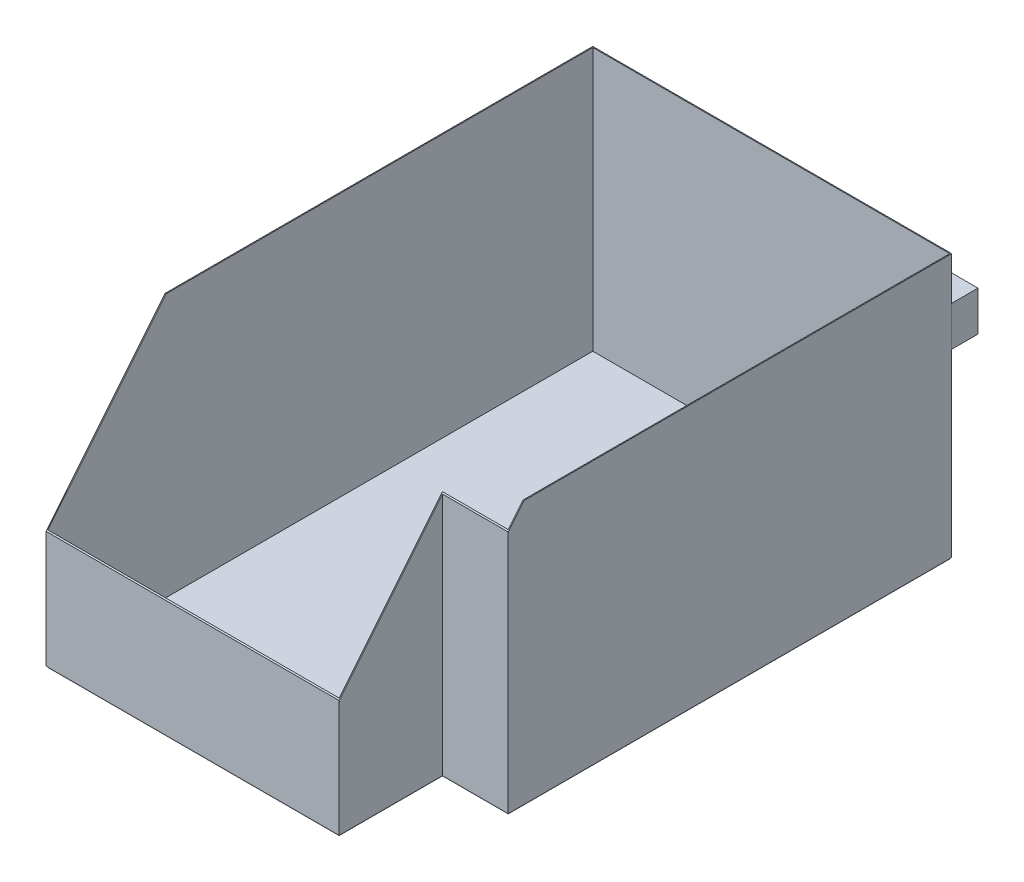
ISO-10303-21;
HEADER;
FILE_DESCRIPTION(('STEP AP214'),'2;1');
FILE_NAME('part.step','',(''),(''),'','','');
FILE_SCHEMA(('AUTOMOTIVE_DESIGN { 1 0 10303 214 1 1 1 1 }'));
ENDSEC;
DATA;
#1=APPLICATION_CONTEXT('core data for automotive mechanical design processes');
#2=APPLICATION_PROTOCOL_DEFINITION('international standard','automotive_design',2000,#1);
#3=PRODUCT_CONTEXT('',#1,'mechanical');
#4=PRODUCT('Part','Part','',(#3));
#5=PRODUCT_RELATED_PRODUCT_CATEGORY('part','',(#4));
#6=PRODUCT_DEFINITION_FORMATION('','',#4);
#7=PRODUCT_DEFINITION_CONTEXT('part definition',#1,'design');
#8=PRODUCT_DEFINITION('design','',#6,#7);
#9=PRODUCT_DEFINITION_SHAPE('','',#8);
#10=(LENGTH_UNIT() NAMED_UNIT(*) SI_UNIT(.MILLI.,.METRE.));
#11=(NAMED_UNIT(*) PLANE_ANGLE_UNIT() SI_UNIT($,.RADIAN.));
#12=(NAMED_UNIT(*) SI_UNIT($,.STERADIAN.) SOLID_ANGLE_UNIT());
#13=UNCERTAINTY_MEASURE_WITH_UNIT(LENGTH_MEASURE(1.E-05),#10,'distance_accuracy_value','');
#14=(GEOMETRIC_REPRESENTATION_CONTEXT(3) GLOBAL_UNCERTAINTY_ASSIGNED_CONTEXT((#13)) GLOBAL_UNIT_ASSIGNED_CONTEXT((#10,
#11,#12)) REPRESENTATION_CONTEXT('',''));
#15=CARTESIAN_POINT('',(0.,0.,0.));
#16=DIRECTION('',(0.,0.,1.));
#17=DIRECTION('',(1.,0.,0.));
#18=AXIS2_PLACEMENT_3D('',#15,#16,#17);
#19=CARTESIAN_POINT('',(232.848616765358,234.676087490139,-197.826300095906));
#20=DIRECTION('',(-1.,0.,0.));
#21=DIRECTION('',(0.,-1.,0.));
#22=AXIS2_PLACEMENT_3D('',#19,#20,#21);
#23=PLANE('',#22);
#24=DIRECTION('',(0.,-1.,0.));
#25=VECTOR('',#24,1.);
#26=CARTESIAN_POINT('',(232.848616765358,234.676087490139,-167.826300095906));
#27=LINE('',#26,#25);
#28=CARTESIAN_POINT('',(232.848616765358,234.676087490139,-167.826300095906));
#29=VERTEX_POINT('',#28);
#30=CARTESIAN_POINT('',(232.848616765358,192.290545925534,-167.826300095906));
#31=VERTEX_POINT('',#30);
#32=EDGE_CURVE('E111',#29,#31,#27,.T.);
#33=ORIENTED_EDGE('',*,*,#32,.T.);
#34=DIRECTION('',(0.,0.,1.));
#35=VECTOR('',#34,1.);
#36=CARTESIAN_POINT('',(232.848616765358,192.290545925534,-197.826300095906));
#37=LINE('',#36,#35);
#38=CARTESIAN_POINT('',(232.848616765358,192.290545925534,-197.826300095906));
#39=VERTEX_POINT('',#38);
#40=EDGE_CURVE('E12',#39,#31,#37,.T.);
#41=ORIENTED_EDGE('',*,*,#40,.F.);
#42=DIRECTION('',(0.,-1.,0.));
#43=VECTOR('',#42,1.);
#44=CARTESIAN_POINT('',(232.848616765358,234.676087490139,-197.826300095906));
#45=LINE('',#44,#43);
#46=CARTESIAN_POINT('',(232.848616765358,234.676087490139,-197.826300095906));
#47=VERTEX_POINT('',#46);
#48=EDGE_CURVE('E99',#47,#39,#45,.T.);
#49=ORIENTED_EDGE('',*,*,#48,.F.);
#50=DIRECTION('',(0.,0.,1.));
#51=VECTOR('',#50,1.);
#52=CARTESIAN_POINT('',(232.848616765358,234.676087490139,-197.826300095906));
#53=LINE('',#52,#51);
#54=EDGE_CURVE('E107',#47,#29,#53,.T.);
#55=ORIENTED_EDGE('',*,*,#54,.T.);
#56=EDGE_LOOP('',(#33,#41,#49,#55));
#57=FACE_BOUND('',#56,.T.);
#58=ADVANCED_FACE('F48',(#57),#23,.F.);
#59=CARTESIAN_POINT('',(232.848616765358,192.290545925534,-197.826300095906));
#60=DIRECTION('',(0.,1.,0.));
#61=DIRECTION('',(0.,0.,1.));
#62=AXIS2_PLACEMENT_3D('',#59,#60,#61);
#63=PLANE('',#62);
#64=DIRECTION('',(-1.,0.,0.));
#65=VECTOR('',#64,1.);
#66=CARTESIAN_POINT('',(232.848616765358,192.290545925534,-167.826300095906));
#67=LINE('',#66,#65);
#68=CARTESIAN_POINT('',(-147.151383234642,192.290545925534,-167.826300095906));
#69=VERTEX_POINT('',#68);
#70=EDGE_CURVE('E103',#31,#69,#67,.T.);
#71=ORIENTED_EDGE('',*,*,#70,.T.);
#72=DIRECTION('',(0.,0.,1.));
#73=VECTOR('',#72,1.);
#74=CARTESIAN_POINT('',(-147.151383234642,192.290545925534,-197.826300095906));
#75=LINE('',#74,#73);
#76=CARTESIAN_POINT('',(-147.151383234642,192.290545925534,-197.826300095906));
#77=VERTEX_POINT('',#76);
#78=EDGE_CURVE('E56',#77,#69,#75,.T.);
#79=ORIENTED_EDGE('',*,*,#78,.F.);
#80=DIRECTION('',(-1.,0.,0.));
#81=VECTOR('',#80,1.);
#82=CARTESIAN_POINT('',(232.848616765358,192.290545925534,-197.826300095906));
#83=LINE('',#82,#81);
#84=EDGE_CURVE('E94',#39,#77,#83,.T.);
#85=ORIENTED_EDGE('',*,*,#84,.F.);
#86=ORIENTED_EDGE('',*,*,#40,.T.);
#87=EDGE_LOOP('',(#71,#79,#85,#86));
#88=FACE_BOUND('',#87,.T.);
#89=ADVANCED_FACE('F102',(#88),#63,.F.);
#90=CARTESIAN_POINT('',(-147.151383234642,234.676087490139,-197.826300095906));
#91=DIRECTION('',(1.,0.,0.));
#92=DIRECTION('',(0.,0.,-1.));
#93=AXIS2_PLACEMENT_3D('',#90,#91,#92);
#94=PLANE('',#93);
#95=DIRECTION('',(0.,1.,0.));
#96=VECTOR('',#95,1.);
#97=CARTESIAN_POINT('',(-147.151383234642,234.676087490139,-167.826300095906));
#98=LINE('',#97,#96);
#99=CARTESIAN_POINT('',(-147.151383234642,234.676087490139,-167.826300095906));
#100=VERTEX_POINT('',#99);
#101=EDGE_CURVE('E81',#69,#100,#98,.T.);
#102=ORIENTED_EDGE('',*,*,#101,.T.);
#103=DIRECTION('',(0.,0.,1.));
#104=VECTOR('',#103,1.);
#105=CARTESIAN_POINT('',(-147.151383234642,234.676087490139,-197.826300095906));
#106=LINE('',#105,#104);
#107=CARTESIAN_POINT('',(-147.151383234642,234.676087490139,-197.826300095906));
#108=VERTEX_POINT('',#107);
#109=EDGE_CURVE('E104',#108,#100,#106,.T.);
#110=ORIENTED_EDGE('',*,*,#109,.F.);
#111=DIRECTION('',(0.,1.,0.));
#112=VECTOR('',#111,1.);
#113=CARTESIAN_POINT('',(-147.151383234642,234.676087490139,-197.826300095906));
#114=LINE('',#113,#112);
#115=EDGE_CURVE('E97',#77,#108,#114,.T.);
#116=ORIENTED_EDGE('',*,*,#115,.F.);
#117=ORIENTED_EDGE('',*,*,#78,.T.);
#118=EDGE_LOOP('',(#102,#110,#116,#117));
#119=FACE_BOUND('',#118,.T.);
#120=ADVANCED_FACE('F105',(#119),#94,.F.);
#121=CARTESIAN_POINT('',(232.848616765358,234.676087490139,-197.826300095906));
#122=DIRECTION('',(0.,-1.,0.));
#123=DIRECTION('',(0.,0.,-1.));
#124=AXIS2_PLACEMENT_3D('',#121,#122,#123);
#125=PLANE('',#124);
#126=DIRECTION('',(1.,0.,0.));
#127=VECTOR('',#126,1.);
#128=CARTESIAN_POINT('',(232.848616765358,234.676087490139,-167.826300095906));
#129=LINE('',#128,#127);
#130=EDGE_CURVE('E87',#100,#29,#129,.T.);
#131=ORIENTED_EDGE('',*,*,#130,.T.);
#132=ORIENTED_EDGE('',*,*,#54,.F.);
#133=DIRECTION('',(1.,0.,0.));
#134=VECTOR('',#133,1.);
#135=CARTESIAN_POINT('',(232.848616765358,234.676087490139,-197.826300095906));
#136=LINE('',#135,#134);
#137=EDGE_CURVE('E64',#108,#47,#136,.T.);
#138=ORIENTED_EDGE('',*,*,#137,.F.);
#139=ORIENTED_EDGE('',*,*,#109,.T.);
#140=EDGE_LOOP('',(#131,#132,#138,#139));
#141=FACE_BOUND('',#140,.T.);
#142=ADVANCED_FACE('F118',(#141),#125,.F.);
#143=CARTESIAN_POINT('',(0.,0.,-197.826300095906));
#144=DIRECTION('',(0.,0.,-1.));
#145=DIRECTION('',(-1.,0.,0.));
#146=AXIS2_PLACEMENT_3D('',#143,#144,#145);
#147=PLANE('',#146);
#148=ORIENTED_EDGE('',*,*,#48,.T.);
#149=ORIENTED_EDGE('',*,*,#84,.T.);
#150=ORIENTED_EDGE('',*,*,#115,.T.);
#151=ORIENTED_EDGE('',*,*,#137,.T.);
#152=EDGE_LOOP('',(#148,#149,#150,#151));
#153=FACE_BOUND('',#152,.T.);
#154=ADVANCED_FACE('F95',(#153),#147,.T.);
#155=CARTESIAN_POINT('',(0.,0.,-167.826300095906));
#156=DIRECTION('',(0.,0.,-1.));
#157=DIRECTION('',(-1.,0.,0.));
#158=AXIS2_PLACEMENT_3D('',#155,#156,#157);
#159=PLANE('',#158);
#160=ORIENTED_EDGE('',*,*,#32,.F.);
#161=ORIENTED_EDGE('',*,*,#130,.F.);
#162=ORIENTED_EDGE('',*,*,#101,.F.);
#163=ORIENTED_EDGE('',*,*,#70,.F.);
#164=EDGE_LOOP('',(#160,#161,#162,#163));
#165=FACE_BOUND('',#164,.T.);
#166=ADVANCED_FACE('F121',(#165),#159,.F.);
#167=CLOSED_SHELL('',(#58,#89,#120,#142,#154,#166));
#168=MANIFOLD_SOLID_BREP('B2',#167);
#169=CARTESIAN_POINT('',(0.,281.5,0.));
#170=DIRECTION('',(0.,1.,0.));
#171=DIRECTION('',(0.,0.,1.));
#172=AXIS2_PLACEMENT_3D('',#169,#170,#171);
#173=PLANE('',#172);
#174=DIRECTION('',(-1.,0.,0.));
#175=VECTOR('',#174,1.);
#176=CARTESIAN_POINT('',(233.848616765358,281.5,286.395099081049));
#177=LINE('',#176,#175);
#178=CARTESIAN_POINT('',(233.848616765358,281.5,286.395099081049));
#179=VERTEX_POINT('',#178);
#180=CARTESIAN_POINT('',(232.848616765358,281.5,286.395099081049));
#181=VERTEX_POINT('',#180);
#182=EDGE_CURVE('E195',#179,#181,#177,.T.);
#183=ORIENTED_EDGE('',*,*,#182,.F.);
#184=DIRECTION('',(0.,0.,-1.));
#185=VECTOR('',#184,1.);
#186=CARTESIAN_POINT('',(233.848616765358,281.5,303.173699904094));
#187=LINE('',#186,#185);
#188=CARTESIAN_POINT('',(233.848616765358,281.5,-168.826300095906));
#189=VERTEX_POINT('',#188);
#190=EDGE_CURVE('E304',#179,#189,#187,.T.);
#191=ORIENTED_EDGE('',*,*,#190,.T.);
#192=DIRECTION('',(-1.,0.,0.));
#193=VECTOR('',#192,1.);
#194=CARTESIAN_POINT('',(233.848616765358,281.5,-168.826300095906));
#195=LINE('',#194,#193);
#196=CARTESIAN_POINT('',(-148.151383234642,281.5,-168.826300095906));
#197=VERTEX_POINT('',#196);
#198=EDGE_CURVE('E302',#189,#197,#195,.T.);
#199=ORIENTED_EDGE('',*,*,#198,.T.);
#200=DIRECTION('',(0.,0.,1.));
#201=VECTOR('',#200,1.);
#202=CARTESIAN_POINT('',(-148.151383234642,281.5,-168.826300095906));
#203=LINE('',#202,#201);
#204=CARTESIAN_POINT('',(-148.151383234642,281.5,286.395099081049));
#205=VERTEX_POINT('',#204);
#206=EDGE_CURVE('E298',#197,#205,#203,.T.);
#207=ORIENTED_EDGE('',*,*,#206,.T.);
#208=CARTESIAN_POINT('',(-147.151383234642,281.5,286.395099081049));
#209=VERTEX_POINT('',#208);
#210=EDGE_CURVE('E281',#209,#205,#177,.T.);
#211=ORIENTED_EDGE('',*,*,#210,.F.);
#212=DIRECTION('',(0.,0.,1.));
#213=VECTOR('',#212,1.);
#214=CARTESIAN_POINT('',(-147.151383234642,281.5,-167.826300095906));
#215=LINE('',#214,#213);
#216=CARTESIAN_POINT('',(-147.151383234642,281.5,-167.826300095906));
#217=VERTEX_POINT('',#216);
#218=EDGE_CURVE('E375',#217,#209,#215,.T.);
#219=ORIENTED_EDGE('',*,*,#218,.F.);
#220=DIRECTION('',(-1.,0.,0.));
#221=VECTOR('',#220,1.);
#222=CARTESIAN_POINT('',(232.848616765358,281.5,-167.826300095906));
#223=LINE('',#222,#221);
#224=CARTESIAN_POINT('',(232.848616765358,281.5,-167.826300095906));
#225=VERTEX_POINT('',#224);
#226=EDGE_CURVE('E373',#225,#217,#223,.T.);
#227=ORIENTED_EDGE('',*,*,#226,.F.);
#228=DIRECTION('',(0.,0.,-1.));
#229=VECTOR('',#228,1.);
#230=CARTESIAN_POINT('',(232.848616765358,281.5,302.173699904094));
#231=LINE('',#230,#229);
#232=EDGE_CURVE('E378',#181,#225,#231,.T.);
#233=ORIENTED_EDGE('',*,*,#232,.F.);
#234=EDGE_LOOP('',(#183,#191,#199,#207,#211,#219,#227,#233));
#235=FACE_BOUND('',#234,.T.);
#236=ADVANCED_FACE('F181',(#235),#173,.T.);
#237=CARTESIAN_POINT('',(0.,1.5,0.));
#238=DIRECTION('',(0.,1.,0.));
#239=DIRECTION('',(0.,0.,1.));
#240=AXIS2_PLACEMENT_3D('',#237,#238,#239);
#241=PLANE('',#240);
#242=DIRECTION('',(0.,0.,1.));
#243=VECTOR('',#242,1.);
#244=CARTESIAN_POINT('',(-148.151383234642,1.5,-168.826300095906));
#245=LINE('',#244,#243);
#246=CARTESIAN_POINT('',(-148.151383234642,1.5,-168.826300095906));
#247=VERTEX_POINT('',#246);
#248=CARTESIAN_POINT('',(-148.151383234642,1.5,413.173699904094));
#249=VERTEX_POINT('',#248);
#250=EDGE_CURVE('E316',#247,#249,#245,.T.);
#251=ORIENTED_EDGE('',*,*,#250,.F.);
#252=DIRECTION('',(-1.,0.,0.));
#253=VECTOR('',#252,1.);
#254=CARTESIAN_POINT('',(233.848616765358,1.5,-168.826300095906));
#255=LINE('',#254,#253);
#256=CARTESIAN_POINT('',(233.848616765358,1.5,-168.826300095906));
#257=VERTEX_POINT('',#256);
#258=EDGE_CURVE('E305',#257,#247,#255,.T.);
#259=ORIENTED_EDGE('',*,*,#258,.F.);
#260=DIRECTION('',(0.,0.,-1.));
#261=VECTOR('',#260,1.);
#262=CARTESIAN_POINT('',(233.848616765358,1.5,303.173699904094));
#263=LINE('',#262,#261);
#264=CARTESIAN_POINT('',(233.848616765358,1.5,303.173699904094));
#265=VERTEX_POINT('',#264);
#266=EDGE_CURVE('E308',#265,#257,#263,.T.);
#267=ORIENTED_EDGE('',*,*,#266,.F.);
#268=DIRECTION('',(1.,0.,0.));
#269=VECTOR('',#268,1.);
#270=CARTESIAN_POINT('',(163.848616765358,1.5,303.173699904094));
#271=LINE('',#270,#269);
#272=CARTESIAN_POINT('',(163.848616765358,1.5,303.173699904094));
#273=VERTEX_POINT('',#272);
#274=EDGE_CURVE('E324',#273,#265,#271,.T.);
#275=ORIENTED_EDGE('',*,*,#274,.F.);
#276=DIRECTION('',(0.,0.,-1.));
#277=VECTOR('',#276,1.);
#278=CARTESIAN_POINT('',(163.848616765358,1.5,413.173699904094));
#279=LINE('',#278,#277);
#280=CARTESIAN_POINT('',(163.848616765358,1.5,413.173699904094));
#281=VERTEX_POINT('',#280);
#282=EDGE_CURVE('E321',#281,#273,#279,.T.);
#283=ORIENTED_EDGE('',*,*,#282,.F.);
#284=DIRECTION('',(1.,0.,0.));
#285=VECTOR('',#284,1.);
#286=CARTESIAN_POINT('',(-148.151383234642,1.5,413.173699904094));
#287=LINE('',#286,#285);
#288=EDGE_CURVE('E318',#249,#281,#287,.T.);
#289=ORIENTED_EDGE('',*,*,#288,.F.);
#290=EDGE_LOOP('',(#251,#259,#267,#275,#283,#289));
#291=FACE_BOUND('',#290,.T.);
#292=DIRECTION('',(-1.,0.,0.));
#293=VECTOR('',#292,1.);
#294=CARTESIAN_POINT('',(232.848616765358,1.5,-167.826300095906));
#295=LINE('',#294,#293);
#296=CARTESIAN_POINT('',(232.848616765358,1.5,-167.826300095906));
#297=VERTEX_POINT('',#296);
#298=CARTESIAN_POINT('',(-147.151383234642,1.5,-167.826300095906));
#299=VERTEX_POINT('',#298);
#300=EDGE_CURVE('E203',#297,#299,#295,.T.);
#301=ORIENTED_EDGE('',*,*,#300,.T.);
#302=DIRECTION('',(0.,0.,1.));
#303=VECTOR('',#302,1.);
#304=CARTESIAN_POINT('',(-147.151383234642,1.5,-167.826300095906));
#305=LINE('',#304,#303);
#306=CARTESIAN_POINT('',(-147.151383234642,1.5,412.173699904094));
#307=VERTEX_POINT('',#306);
#308=EDGE_CURVE('E368',#299,#307,#305,.T.);
#309=ORIENTED_EDGE('',*,*,#308,.T.);
#310=DIRECTION('',(1.,0.,0.));
#311=VECTOR('',#310,1.);
#312=CARTESIAN_POINT('',(-147.151383234642,1.5,412.173699904094));
#313=LINE('',#312,#311);
#314=CARTESIAN_POINT('',(162.848616765358,1.5,412.173699904094));
#315=VERTEX_POINT('',#314);
#316=EDGE_CURVE('E383',#307,#315,#313,.T.);
#317=ORIENTED_EDGE('',*,*,#316,.T.);
#318=DIRECTION('',(0.,0.,-1.));
#319=VECTOR('',#318,1.);
#320=CARTESIAN_POINT('',(162.848616765358,1.5,412.173699904094));
#321=LINE('',#320,#319);
#322=CARTESIAN_POINT('',(162.848616765358,1.5,302.173699904094));
#323=VERTEX_POINT('',#322);
#324=EDGE_CURVE('E386',#315,#323,#321,.T.);
#325=ORIENTED_EDGE('',*,*,#324,.T.);
#326=DIRECTION('',(1.,0.,0.));
#327=VECTOR('',#326,1.);
#328=CARTESIAN_POINT('',(162.848616765358,1.5,302.173699904094));
#329=LINE('',#328,#327);
#330=CARTESIAN_POINT('',(232.848616765358,1.5,302.173699904094));
#331=VERTEX_POINT('',#330);
#332=EDGE_CURVE('E389',#323,#331,#329,.T.);
#333=ORIENTED_EDGE('',*,*,#332,.T.);
#334=DIRECTION('',(0.,0.,-1.));
#335=VECTOR('',#334,1.);
#336=CARTESIAN_POINT('',(232.848616765358,1.5,302.173699904094));
#337=LINE('',#336,#335);
#338=EDGE_CURVE('E376',#331,#297,#337,.T.);
#339=ORIENTED_EDGE('',*,*,#338,.T.);
#340=EDGE_LOOP('',(#301,#309,#317,#325,#333,#339));
#341=FACE_BOUND('',#340,.T.);
#342=ADVANCED_FACE('F345',(#291,#341),#241,.F.);
#343=CARTESIAN_POINT('',(-148.151383234642,281.5,-168.826300095906));
#344=DIRECTION('',(1.,0.,0.));
#345=DIRECTION('',(0.,0.,-1.));
#346=AXIS2_PLACEMENT_3D('',#343,#344,#345);
#347=PLANE('',#346);
#348=DIRECTION('',(0.,-1.,0.));
#349=VECTOR('',#348,1.);
#350=CARTESIAN_POINT('',(-148.151383234642,281.5,413.173699904094));
#351=LINE('',#350,#349);
#352=CARTESIAN_POINT('',(-148.151383234642,125.528052126202,413.173699904094));
#353=VERTEX_POINT('',#352);
#354=EDGE_CURVE('E189',#353,#249,#351,.T.);
#355=ORIENTED_EDGE('',*,*,#354,.F.);
#356=DIRECTION('',(0.,-0.775988846940404,0.630746628547551));
#357=VECTOR('',#356,1.);
#358=CARTESIAN_POINT('',(-148.151383234642,125.528052126202,413.173699904094));
#359=LINE('',#358,#357);
#360=EDGE_CURVE('E284',#205,#353,#359,.T.);
#361=ORIENTED_EDGE('',*,*,#360,.F.);
#362=ORIENTED_EDGE('',*,*,#206,.F.);
#363=DIRECTION('',(0.,-1.,0.));
#364=VECTOR('',#363,1.);
#365=CARTESIAN_POINT('',(-148.151383234642,281.5,-168.826300095906));
#366=LINE('',#365,#364);
#367=EDGE_CURVE('E315',#197,#247,#366,.T.);
#368=ORIENTED_EDGE('',*,*,#367,.T.);
#369=ORIENTED_EDGE('',*,*,#250,.T.);
#370=EDGE_LOOP('',(#355,#361,#362,#368,#369));
#371=FACE_BOUND('',#370,.T.);
#372=ADVANCED_FACE('F183',(#371),#347,.F.);
#373=CARTESIAN_POINT('',(-148.151383234642,281.5,413.173699904094));
#374=DIRECTION('',(0.,0.,-1.));
#375=DIRECTION('',(-1.,0.,0.));
#376=AXIS2_PLACEMENT_3D('',#373,#374,#375);
#377=PLANE('',#376);
#378=DIRECTION('',(0.,-1.,0.));
#379=VECTOR('',#378,1.);
#380=CARTESIAN_POINT('',(163.848616765358,281.5,413.173699904094));
#381=LINE('',#380,#379);
#382=CARTESIAN_POINT('',(163.848616765358,125.528052126202,413.173699904094));
#383=VERTEX_POINT('',#382);
#384=EDGE_CURVE('E336',#383,#281,#381,.T.);
#385=ORIENTED_EDGE('',*,*,#384,.F.);
#386=DIRECTION('',(-1.,0.,0.));
#387=VECTOR('',#386,1.);
#388=CARTESIAN_POINT('',(233.848616765358,125.528052126202,413.173699904094));
#389=LINE('',#388,#387);
#390=EDGE_CURVE('E342',#383,#353,#389,.T.);
#391=ORIENTED_EDGE('',*,*,#390,.T.);
#392=ORIENTED_EDGE('',*,*,#354,.T.);
#393=ORIENTED_EDGE('',*,*,#288,.T.);
#394=EDGE_LOOP('',(#385,#391,#392,#393));
#395=FACE_BOUND('',#394,.T.);
#396=ADVANCED_FACE('F340',(#395),#377,.F.);
#397=CARTESIAN_POINT('',(163.848616765358,281.5,413.173699904094));
#398=DIRECTION('',(-1.,0.,0.));
#399=DIRECTION('',(0.,0.,1.));
#400=AXIS2_PLACEMENT_3D('',#397,#398,#399);
#401=PLANE('',#400);
#402=DIRECTION('',(0.,-1.,0.));
#403=VECTOR('',#402,1.);
#404=CARTESIAN_POINT('',(163.848616765358,281.5,303.173699904094));
#405=LINE('',#404,#403);
#406=CARTESIAN_POINT('',(163.848616765358,260.857785651697,303.173699904094));
#407=VERTEX_POINT('',#406);
#408=EDGE_CURVE('E334',#407,#273,#405,.T.);
#409=ORIENTED_EDGE('',*,*,#408,.F.);
#410=DIRECTION('',(0.,-0.775988846940404,0.630746628547551));
#411=VECTOR('',#410,1.);
#412=CARTESIAN_POINT('',(163.848616765358,219.44791602446,336.832863639444));
#413=LINE('',#412,#411);
#414=EDGE_CURVE('E366',#407,#383,#413,.T.);
#415=ORIENTED_EDGE('',*,*,#414,.T.);
#416=ORIENTED_EDGE('',*,*,#384,.T.);
#417=ORIENTED_EDGE('',*,*,#282,.T.);
#418=EDGE_LOOP('',(#409,#415,#416,#417));
#419=FACE_BOUND('',#418,.T.);
#420=ADVANCED_FACE('F365',(#419),#401,.F.);
#421=CARTESIAN_POINT('',(163.848616765358,281.5,303.173699904094));
#422=DIRECTION('',(0.,0.,-1.));
#423=DIRECTION('',(-1.,0.,0.));
#424=AXIS2_PLACEMENT_3D('',#421,#422,#423);
#425=PLANE('',#424);
#426=DIRECTION('',(0.,-1.,0.));
#427=VECTOR('',#426,1.);
#428=CARTESIAN_POINT('',(233.848616765358,281.5,303.173699904094));
#429=LINE('',#428,#427);
#430=CARTESIAN_POINT('',(233.848616765358,260.857785651697,303.173699904094));
#431=VERTEX_POINT('',#430);
#432=EDGE_CURVE('E332',#431,#265,#429,.T.);
#433=ORIENTED_EDGE('',*,*,#432,.F.);
#434=DIRECTION('',(-1.,0.,0.));
#435=VECTOR('',#434,1.);
#436=CARTESIAN_POINT('',(163.848616765358,260.857785651697,303.173699904094));
#437=LINE('',#436,#435);
#438=EDGE_CURVE('E362',#431,#407,#437,.T.);
#439=ORIENTED_EDGE('',*,*,#438,.T.);
#440=ORIENTED_EDGE('',*,*,#408,.T.);
#441=ORIENTED_EDGE('',*,*,#274,.T.);
#442=EDGE_LOOP('',(#433,#439,#440,#441));
#443=FACE_BOUND('',#442,.T.);
#444=ADVANCED_FACE('F360',(#443),#425,.F.);
#445=CARTESIAN_POINT('',(233.848616765358,281.5,303.173699904094));
#446=DIRECTION('',(-1.,0.,0.));
#447=DIRECTION('',(0.,0.,1.));
#448=AXIS2_PLACEMENT_3D('',#445,#446,#447);
#449=PLANE('',#448);
#450=ORIENTED_EDGE('',*,*,#190,.F.);
#451=DIRECTION('',(0.,-0.775988846940404,0.630746628547551));
#452=VECTOR('',#451,1.);
#453=CARTESIAN_POINT('',(233.848616765358,125.528052126202,413.173699904094));
#454=LINE('',#453,#452);
#455=EDGE_CURVE('E292',#179,#431,#454,.T.);
#456=ORIENTED_EDGE('',*,*,#455,.T.);
#457=ORIENTED_EDGE('',*,*,#432,.T.);
#458=ORIENTED_EDGE('',*,*,#266,.T.);
#459=DIRECTION('',(0.,-1.,0.));
#460=VECTOR('',#459,1.);
#461=CARTESIAN_POINT('',(233.848616765358,281.5,-168.826300095906));
#462=LINE('',#461,#460);
#463=EDGE_CURVE('E329',#189,#257,#462,.T.);
#464=ORIENTED_EDGE('',*,*,#463,.F.);
#465=EDGE_LOOP('',(#450,#456,#457,#458,#464));
#466=FACE_BOUND('',#465,.T.);
#467=ADVANCED_FACE('F355',(#466),#449,.F.);
#468=CARTESIAN_POINT('',(233.848616765358,281.5,-168.826300095906));
#469=DIRECTION('',(0.,0.,1.));
#470=DIRECTION('',(1.,0.,0.));
#471=AXIS2_PLACEMENT_3D('',#468,#469,#470);
#472=PLANE('',#471);
#473=ORIENTED_EDGE('',*,*,#258,.T.);
#474=ORIENTED_EDGE('',*,*,#367,.F.);
#475=ORIENTED_EDGE('',*,*,#198,.F.);
#476=ORIENTED_EDGE('',*,*,#463,.T.);
#477=EDGE_LOOP('',(#473,#474,#475,#476));
#478=FACE_BOUND('',#477,.T.);
#479=ADVANCED_FACE('F350',(#478),#472,.F.);
#480=CARTESIAN_POINT('',(232.848616765358,281.5,-167.826300095906));
#481=DIRECTION('',(0.,0.,1.));
#482=DIRECTION('',(1.,0.,0.));
#483=AXIS2_PLACEMENT_3D('',#480,#481,#482);
#484=PLANE('',#483);
#485=ORIENTED_EDGE('',*,*,#300,.F.);
#486=DIRECTION('',(0.,-1.,0.));
#487=VECTOR('',#486,1.);
#488=CARTESIAN_POINT('',(232.848616765358,281.5,-167.826300095906));
#489=LINE('',#488,#487);
#490=EDGE_CURVE('E379',#225,#297,#489,.T.);
#491=ORIENTED_EDGE('',*,*,#490,.F.);
#492=ORIENTED_EDGE('',*,*,#226,.T.);
#493=DIRECTION('',(0.,-1.,0.));
#494=VECTOR('',#493,1.);
#495=CARTESIAN_POINT('',(-147.151383234642,281.5,-167.826300095906));
#496=LINE('',#495,#494);
#497=EDGE_CURVE('E311',#217,#299,#496,.T.);
#498=ORIENTED_EDGE('',*,*,#497,.T.);
#499=EDGE_LOOP('',(#485,#491,#492,#498));
#500=FACE_BOUND('',#499,.T.);
#501=ADVANCED_FACE('F405',(#500),#484,.T.);
#502=CARTESIAN_POINT('',(-147.151383234642,281.5,-167.826300095906));
#503=DIRECTION('',(1.,0.,0.));
#504=DIRECTION('',(0.,0.,-1.));
#505=AXIS2_PLACEMENT_3D('',#502,#503,#504);
#506=PLANE('',#505);
#507=DIRECTION('',(0.,0.775988846940404,-0.630746628547551));
#508=VECTOR('',#507,1.);
#509=CARTESIAN_POINT('',(-147.151383234642,503.819730792392,105.687062864041));
#510=LINE('',#509,#508);
#511=CARTESIAN_POINT('',(-147.151383234642,126.758322430979,412.173699904094));
#512=VERTEX_POINT('',#511);
#513=EDGE_CURVE('E287',#512,#209,#510,.T.);
#514=ORIENTED_EDGE('',*,*,#513,.F.);
#515=DIRECTION('',(0.,-1.,0.));
#516=VECTOR('',#515,1.);
#517=CARTESIAN_POINT('',(-147.151383234642,281.5,412.173699904094));
#518=LINE('',#517,#516);
#519=EDGE_CURVE('E400',#512,#307,#518,.T.);
#520=ORIENTED_EDGE('',*,*,#519,.T.);
#521=ORIENTED_EDGE('',*,*,#308,.F.);
#522=ORIENTED_EDGE('',*,*,#497,.F.);
#523=ORIENTED_EDGE('',*,*,#218,.T.);
#524=EDGE_LOOP('',(#514,#520,#521,#522,#523));
#525=FACE_BOUND('',#524,.T.);
#526=ADVANCED_FACE('F413',(#525),#506,.T.);
#527=CARTESIAN_POINT('',(-147.151383234642,281.5,412.173699904094));
#528=DIRECTION('',(0.,0.,-1.));
#529=DIRECTION('',(-1.,0.,0.));
#530=AXIS2_PLACEMENT_3D('',#527,#528,#529);
#531=PLANE('',#530);
#532=DIRECTION('',(-1.,0.,0.));
#533=VECTOR('',#532,1.);
#534=CARTESIAN_POINT('',(-147.151383234642,126.758322430979,412.173699904094));
#535=LINE('',#534,#533);
#536=CARTESIAN_POINT('',(162.848616765358,126.758322430979,412.173699904094));
#537=VERTEX_POINT('',#536);
#538=EDGE_CURVE('E414',#537,#512,#535,.T.);
#539=ORIENTED_EDGE('',*,*,#538,.F.);
#540=DIRECTION('',(0.,-1.,0.));
#541=VECTOR('',#540,1.);
#542=CARTESIAN_POINT('',(162.848616765358,281.5,412.173699904094));
#543=LINE('',#542,#541);
#544=EDGE_CURVE('E399',#537,#315,#543,.T.);
#545=ORIENTED_EDGE('',*,*,#544,.T.);
#546=ORIENTED_EDGE('',*,*,#316,.F.);
#547=ORIENTED_EDGE('',*,*,#519,.F.);
#548=EDGE_LOOP('',(#539,#545,#546,#547));
#549=FACE_BOUND('',#548,.T.);
#550=ADVANCED_FACE('F417',(#549),#531,.T.);
#551=CARTESIAN_POINT('',(162.848616765358,281.5,412.173699904094));
#552=DIRECTION('',(-1.,0.,0.));
#553=DIRECTION('',(0.,0.,1.));
#554=AXIS2_PLACEMENT_3D('',#551,#552,#553);
#555=PLANE('',#554);
#556=DIRECTION('',(0.,-0.775988846940404,0.630746628547551));
#557=VECTOR('',#556,1.);
#558=CARTESIAN_POINT('',(162.848616765358,219.937368373458,336.43502233002));
#559=LINE('',#558,#557);
#560=CARTESIAN_POINT('',(162.848616765358,262.088055956474,302.173699904094));
#561=VERTEX_POINT('',#560);
#562=EDGE_CURVE('E424',#561,#537,#559,.T.);
#563=ORIENTED_EDGE('',*,*,#562,.F.);
#564=DIRECTION('',(0.,-1.,0.));
#565=VECTOR('',#564,1.);
#566=CARTESIAN_POINT('',(162.848616765358,281.5,302.173699904094));
#567=LINE('',#566,#565);
#568=EDGE_CURVE('E397',#561,#323,#567,.T.);
#569=ORIENTED_EDGE('',*,*,#568,.T.);
#570=ORIENTED_EDGE('',*,*,#324,.F.);
#571=ORIENTED_EDGE('',*,*,#544,.F.);
#572=EDGE_LOOP('',(#563,#569,#570,#571));
#573=FACE_BOUND('',#572,.T.);
#574=ADVANCED_FACE('F422',(#573),#555,.T.);
#575=CARTESIAN_POINT('',(162.848616765358,281.5,302.173699904094));
#576=DIRECTION('',(0.,0.,-1.));
#577=DIRECTION('',(-1.,0.,0.));
#578=AXIS2_PLACEMENT_3D('',#575,#576,#577);
#579=PLANE('',#578);
#580=DIRECTION('',(-1.,0.,0.));
#581=VECTOR('',#580,1.);
#582=CARTESIAN_POINT('',(162.848616765358,262.088055956474,302.173699904094));
#583=LINE('',#582,#581);
#584=CARTESIAN_POINT('',(232.848616765358,262.088055956474,302.173699904094));
#585=VERTEX_POINT('',#584);
#586=EDGE_CURVE('E428',#585,#561,#583,.T.);
#587=ORIENTED_EDGE('',*,*,#586,.F.);
#588=DIRECTION('',(0.,-1.,0.));
#589=VECTOR('',#588,1.);
#590=CARTESIAN_POINT('',(232.848616765358,281.5,302.173699904094));
#591=LINE('',#590,#589);
#592=EDGE_CURVE('E395',#585,#331,#591,.T.);
#593=ORIENTED_EDGE('',*,*,#592,.T.);
#594=ORIENTED_EDGE('',*,*,#332,.F.);
#595=ORIENTED_EDGE('',*,*,#568,.F.);
#596=EDGE_LOOP('',(#587,#593,#594,#595));
#597=FACE_BOUND('',#596,.T.);
#598=ADVANCED_FACE('F427',(#597),#579,.T.);
#599=CARTESIAN_POINT('',(232.848616765358,281.5,302.173699904094));
#600=DIRECTION('',(-1.,0.,0.));
#601=DIRECTION('',(0.,0.,1.));
#602=AXIS2_PLACEMENT_3D('',#599,#600,#601);
#603=PLANE('',#602);
#604=DIRECTION('',(0.,-0.775988846940404,0.630746628547551));
#605=VECTOR('',#604,1.);
#606=CARTESIAN_POINT('',(232.848616765358,273.777126763256,292.672478293369));
#607=LINE('',#606,#605);
#608=EDGE_CURVE('E46',#181,#585,#607,.T.);
#609=ORIENTED_EDGE('',*,*,#608,.F.);
#610=ORIENTED_EDGE('',*,*,#232,.T.);
#611=ORIENTED_EDGE('',*,*,#490,.T.);
#612=ORIENTED_EDGE('',*,*,#338,.F.);
#613=ORIENTED_EDGE('',*,*,#592,.F.);
#614=EDGE_LOOP('',(#609,#610,#611,#612,#613));
#615=FACE_BOUND('',#614,.T.);
#616=ADVANCED_FACE('F411',(#615),#603,.T.);
#617=CARTESIAN_POINT('',(233.848616765358,125.528052126202,413.173699904094));
#618=DIRECTION('',(0.,-0.630746628547551,-0.775988846940404));
#619=DIRECTION('',(0.,0.775988846940404,-0.630746628547551));
#620=AXIS2_PLACEMENT_3D('',#617,#618,#619);
#621=PLANE('',#620);
#622=ORIENTED_EDGE('',*,*,#438,.F.);
#623=ORIENTED_EDGE('',*,*,#455,.F.);
#624=ORIENTED_EDGE('',*,*,#182,.T.);
#625=ORIENTED_EDGE('',*,*,#608,.T.);
#626=ORIENTED_EDGE('',*,*,#586,.T.);
#627=ORIENTED_EDGE('',*,*,#562,.T.);
#628=ORIENTED_EDGE('',*,*,#538,.T.);
#629=ORIENTED_EDGE('',*,*,#513,.T.);
#630=ORIENTED_EDGE('',*,*,#210,.T.);
#631=ORIENTED_EDGE('',*,*,#360,.T.);
#632=ORIENTED_EDGE('',*,*,#390,.F.);
#633=ORIENTED_EDGE('',*,*,#414,.F.);
#634=EDGE_LOOP('',(#622,#623,#624,#625,#626,#627,#628,#629,#630,#631,#632,#633));
#635=FACE_BOUND('',#634,.T.);
#636=ADVANCED_FACE('F283',(#635),#621,.F.);
#637=CLOSED_SHELL('',(#236,#342,#372,#396,#420,#444,#467,#479,#501,#526,#550,#574,#598,#616,#636));
#638=MANIFOLD_SOLID_BREP('B6',#637);
#639=CARTESIAN_POINT('',(-147.151383234642,1.5,-167.826300095906));
#640=DIRECTION('',(1.,0.,0.));
#641=DIRECTION('',(0.,0.,-1.));
#642=AXIS2_PLACEMENT_3D('',#639,#640,#641);
#643=PLANE('',#642);
#644=DIRECTION('',(0.,0.,1.));
#645=VECTOR('',#644,1.);
#646=CARTESIAN_POINT('',(-147.151383234642,0.,-167.826300095906));
#647=LINE('',#646,#645);
#648=CARTESIAN_POINT('',(-147.151383234642,0.,-167.826300095906));
#649=VERTEX_POINT('',#648);
#650=CARTESIAN_POINT('',(-147.151383234642,0.,412.173699904094));
#651=VERTEX_POINT('',#650);
#652=EDGE_CURVE('E639',#649,#651,#647,.T.);
#653=ORIENTED_EDGE('',*,*,#652,.T.);
#654=DIRECTION('',(0.,-1.,0.));
#655=VECTOR('',#654,1.);
#656=CARTESIAN_POINT('',(-147.151383234642,1.5,412.173699904094));
#657=LINE('',#656,#655);
#658=CARTESIAN_POINT('',(-147.151383234642,1.5,412.173699904094));
#659=VERTEX_POINT('',#658);
#660=EDGE_CURVE('E179',#659,#651,#657,.T.);
#661=ORIENTED_EDGE('',*,*,#660,.F.);
#662=DIRECTION('',(0.,0.,1.));
#663=VECTOR('',#662,1.);
#664=CARTESIAN_POINT('',(-147.151383234642,1.5,-167.826300095906));
#665=LINE('',#664,#663);
#666=CARTESIAN_POINT('',(-147.151383234642,1.5,-167.826300095906));
#667=VERTEX_POINT('',#666);
#668=EDGE_CURVE('E649',#667,#659,#665,.T.);
#669=ORIENTED_EDGE('',*,*,#668,.F.);
#670=DIRECTION('',(0.,-1.,0.));
#671=VECTOR('',#670,1.);
#672=CARTESIAN_POINT('',(-147.151383234642,1.5,-167.826300095906));
#673=LINE('',#672,#671);
#674=EDGE_CURVE('E635',#667,#649,#673,.T.);
#675=ORIENTED_EDGE('',*,*,#674,.T.);
#676=EDGE_LOOP('',(#653,#661,#669,#675));
#677=FACE_BOUND('',#676,.T.);
#678=ADVANCED_FACE('F555',(#677),#643,.F.);
#679=CARTESIAN_POINT('',(-147.151383234642,1.5,412.173699904094));
#680=DIRECTION('',(0.,0.,-1.));
#681=DIRECTION('',(-1.,0.,0.));
#682=AXIS2_PLACEMENT_3D('',#679,#680,#681);
#683=PLANE('',#682);
#684=DIRECTION('',(1.,0.,0.));
#685=VECTOR('',#684,1.);
#686=CARTESIAN_POINT('',(-147.151383234642,0.,412.173699904094));
#687=LINE('',#686,#685);
#688=CARTESIAN_POINT('',(162.848616765358,0.,412.173699904094));
#689=VERTEX_POINT('',#688);
#690=EDGE_CURVE('E642',#651,#689,#687,.T.);
#691=ORIENTED_EDGE('',*,*,#690,.T.);
#692=DIRECTION('',(0.,-1.,0.));
#693=VECTOR('',#692,1.);
#694=CARTESIAN_POINT('',(162.848616765358,1.5,412.173699904094));
#695=LINE('',#694,#693);
#696=CARTESIAN_POINT('',(162.848616765358,1.5,412.173699904094));
#697=VERTEX_POINT('',#696);
#698=EDGE_CURVE('E563',#697,#689,#695,.T.);
#699=ORIENTED_EDGE('',*,*,#698,.F.);
#700=DIRECTION('',(1.,0.,0.));
#701=VECTOR('',#700,1.);
#702=CARTESIAN_POINT('',(-147.151383234642,1.5,412.173699904094));
#703=LINE('',#702,#701);
#704=EDGE_CURVE('E608',#659,#697,#703,.T.);
#705=ORIENTED_EDGE('',*,*,#704,.F.);
#706=ORIENTED_EDGE('',*,*,#660,.T.);
#707=EDGE_LOOP('',(#691,#699,#705,#706));
#708=FACE_BOUND('',#707,.T.);
#709=ADVANCED_FACE('F673',(#708),#683,.F.);
#710=CARTESIAN_POINT('',(162.848616765358,1.5,302.173699904094));
#711=DIRECTION('',(-1.,0.,0.));
#712=DIRECTION('',(0.,0.,1.));
#713=AXIS2_PLACEMENT_3D('',#710,#711,#712);
#714=PLANE('',#713);
#715=DIRECTION('',(0.,0.,-1.));
#716=VECTOR('',#715,1.);
#717=CARTESIAN_POINT('',(162.848616765358,0.,302.173699904094));
#718=LINE('',#717,#716);
#719=CARTESIAN_POINT('',(162.848616765358,0.,302.173699904094));
#720=VERTEX_POINT('',#719);
#721=EDGE_CURVE('E644',#689,#720,#718,.T.);
#722=ORIENTED_EDGE('',*,*,#721,.T.);
#723=DIRECTION('',(0.,-1.,0.));
#724=VECTOR('',#723,1.);
#725=CARTESIAN_POINT('',(162.848616765358,1.5,302.173699904094));
#726=LINE('',#725,#724);
#727=CARTESIAN_POINT('',(162.848616765358,1.5,302.173699904094));
#728=VERTEX_POINT('',#727);
#729=EDGE_CURVE('E630',#728,#720,#726,.T.);
#730=ORIENTED_EDGE('',*,*,#729,.F.);
#731=DIRECTION('',(0.,0.,-1.));
#732=VECTOR('',#731,1.);
#733=CARTESIAN_POINT('',(162.848616765358,1.5,302.173699904094));
#734=LINE('',#733,#732);
#735=EDGE_CURVE('E621',#697,#728,#734,.T.);
#736=ORIENTED_EDGE('',*,*,#735,.F.);
#737=ORIENTED_EDGE('',*,*,#698,.T.);
#738=EDGE_LOOP('',(#722,#730,#736,#737));
#739=FACE_BOUND('',#738,.T.);
#740=ADVANCED_FACE('F655',(#739),#714,.F.);
#741=CARTESIAN_POINT('',(232.848616765358,1.5,302.173699904094));
#742=DIRECTION('',(0.,0.,-1.));
#743=DIRECTION('',(-1.,0.,0.));
#744=AXIS2_PLACEMENT_3D('',#741,#742,#743);
#745=PLANE('',#744);
#746=DIRECTION('',(1.,0.,0.));
#747=VECTOR('',#746,1.);
#748=CARTESIAN_POINT('',(232.848616765358,0.,302.173699904094));
#749=LINE('',#748,#747);
#750=CARTESIAN_POINT('',(232.848616765358,0.,302.173699904094));
#751=VERTEX_POINT('',#750);
#752=EDGE_CURVE('E629',#720,#751,#749,.T.);
#753=ORIENTED_EDGE('',*,*,#752,.T.);
#754=DIRECTION('',(0.,-1.,0.));
#755=VECTOR('',#754,1.);
#756=CARTESIAN_POINT('',(232.848616765358,1.5,302.173699904094));
#757=LINE('',#756,#755);
#758=CARTESIAN_POINT('',(232.848616765358,1.5,302.173699904094));
#759=VERTEX_POINT('',#758);
#760=EDGE_CURVE('E626',#759,#751,#757,.T.);
#761=ORIENTED_EDGE('',*,*,#760,.F.);
#762=DIRECTION('',(1.,0.,0.));
#763=VECTOR('',#762,1.);
#764=CARTESIAN_POINT('',(232.848616765358,1.5,302.173699904094));
#765=LINE('',#764,#763);
#766=EDGE_CURVE('E615',#728,#759,#765,.T.);
#767=ORIENTED_EDGE('',*,*,#766,.F.);
#768=ORIENTED_EDGE('',*,*,#729,.T.);
#769=EDGE_LOOP('',(#753,#761,#767,#768));
#770=FACE_BOUND('',#769,.T.);
#771=ADVANCED_FACE('F627',(#770),#745,.F.);
#772=CARTESIAN_POINT('',(232.848616765358,1.5,-167.826300095906));
#773=DIRECTION('',(-1.,0.,0.));
#774=DIRECTION('',(0.,0.,1.));
#775=AXIS2_PLACEMENT_3D('',#772,#773,#774);
#776=PLANE('',#775);
#777=DIRECTION('',(0.,0.,-1.));
#778=VECTOR('',#777,1.);
#779=CARTESIAN_POINT('',(232.848616765358,0.,-167.826300095906));
#780=LINE('',#779,#778);
#781=CARTESIAN_POINT('',(232.848616765358,0.,-167.826300095906));
#782=VERTEX_POINT('',#781);
#783=EDGE_CURVE('E594',#751,#782,#780,.T.);
#784=ORIENTED_EDGE('',*,*,#783,.T.);
#785=DIRECTION('',(0.,-1.,0.));
#786=VECTOR('',#785,1.);
#787=CARTESIAN_POINT('',(232.848616765358,1.5,-167.826300095906));
#788=LINE('',#787,#786);
#789=CARTESIAN_POINT('',(232.848616765358,1.5,-167.826300095906));
#790=VERTEX_POINT('',#789);
#791=EDGE_CURVE('E631',#790,#782,#788,.T.);
#792=ORIENTED_EDGE('',*,*,#791,.F.);
#793=DIRECTION('',(0.,0.,-1.));
#794=VECTOR('',#793,1.);
#795=CARTESIAN_POINT('',(232.848616765358,1.5,-167.826300095906));
#796=LINE('',#795,#794);
#797=EDGE_CURVE('E619',#759,#790,#796,.T.);
#798=ORIENTED_EDGE('',*,*,#797,.F.);
#799=ORIENTED_EDGE('',*,*,#760,.T.);
#800=EDGE_LOOP('',(#784,#792,#798,#799));
#801=FACE_BOUND('',#800,.T.);
#802=ADVANCED_FACE('F633',(#801),#776,.F.);
#803=CARTESIAN_POINT('',(-147.151383234642,1.5,-167.826300095906));
#804=DIRECTION('',(0.,0.,1.));
#805=DIRECTION('',(1.,0.,0.));
#806=AXIS2_PLACEMENT_3D('',#803,#804,#805);
#807=PLANE('',#806);
#808=DIRECTION('',(-1.,0.,0.));
#809=VECTOR('',#808,1.);
#810=CARTESIAN_POINT('',(-147.151383234642,0.,-167.826300095906));
#811=LINE('',#810,#809);
#812=EDGE_CURVE('E600',#782,#649,#811,.T.);
#813=ORIENTED_EDGE('',*,*,#812,.T.);
#814=ORIENTED_EDGE('',*,*,#674,.F.);
#815=DIRECTION('',(-1.,0.,0.));
#816=VECTOR('',#815,1.);
#817=CARTESIAN_POINT('',(-147.151383234642,1.5,-167.826300095906));
#818=LINE('',#817,#816);
#819=EDGE_CURVE('E571',#790,#667,#818,.T.);
#820=ORIENTED_EDGE('',*,*,#819,.F.);
#821=ORIENTED_EDGE('',*,*,#791,.T.);
#822=EDGE_LOOP('',(#813,#814,#820,#821));
#823=FACE_BOUND('',#822,.T.);
#824=ADVANCED_FACE('F662',(#823),#807,.F.);
#825=CARTESIAN_POINT('',(0.,1.5,0.));
#826=DIRECTION('',(0.,1.,0.));
#827=DIRECTION('',(0.,0.,1.));
#828=AXIS2_PLACEMENT_3D('',#825,#826,#827);
#829=PLANE('',#828);
#830=ORIENTED_EDGE('',*,*,#668,.T.);
#831=ORIENTED_EDGE('',*,*,#704,.T.);
#832=ORIENTED_EDGE('',*,*,#735,.T.);
#833=ORIENTED_EDGE('',*,*,#766,.T.);
#834=ORIENTED_EDGE('',*,*,#797,.T.);
#835=ORIENTED_EDGE('',*,*,#819,.T.);
#836=EDGE_LOOP('',(#830,#831,#832,#833,#834,#835));
#837=FACE_BOUND('',#836,.T.);
#838=ADVANCED_FACE('F617',(#837),#829,.T.);
#839=CARTESIAN_POINT('',(0.,0.,0.));
#840=DIRECTION('',(0.,1.,0.));
#841=DIRECTION('',(0.,0.,1.));
#842=AXIS2_PLACEMENT_3D('',#839,#840,#841);
#843=PLANE('',#842);
#844=ORIENTED_EDGE('',*,*,#652,.F.);
#845=ORIENTED_EDGE('',*,*,#812,.F.);
#846=ORIENTED_EDGE('',*,*,#783,.F.);
#847=ORIENTED_EDGE('',*,*,#752,.F.);
#848=ORIENTED_EDGE('',*,*,#721,.F.);
#849=ORIENTED_EDGE('',*,*,#690,.F.);
#850=EDGE_LOOP('',(#844,#845,#846,#847,#848,#849));
#851=FACE_BOUND('',#850,.T.);
#852=ADVANCED_FACE('F658',(#851),#843,.F.);
#853=CLOSED_SHELL('',(#678,#709,#740,#771,#802,#824,#838,#852));
#854=MANIFOLD_SOLID_BREP('B40',#853);
#855=ADVANCED_BREP_SHAPE_REPRESENTATION('',(#18,#168,#638,#854),#14);
#856=SHAPE_DEFINITION_REPRESENTATION(#9,#855);
ENDSEC;
END-ISO-10303-21;
